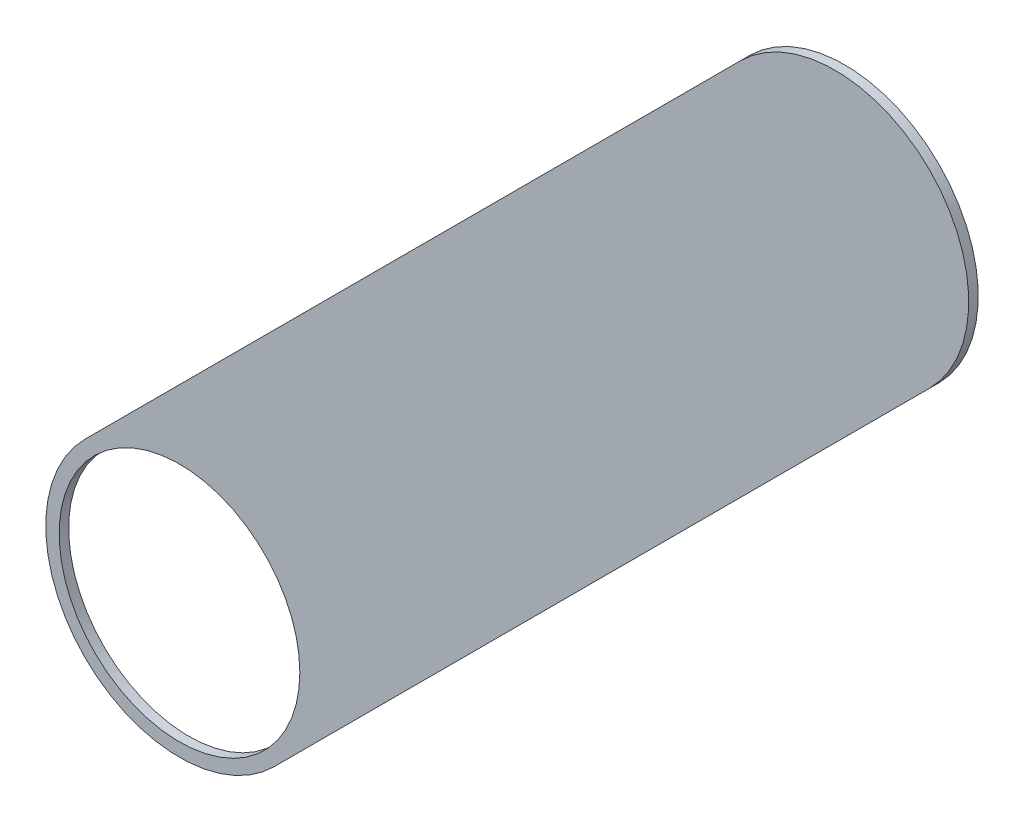
ISO-10303-21;
HEADER;
FILE_DESCRIPTION(('STEP AP214'),'2;1');
FILE_NAME('part.step','',(''),(''),'','','');
FILE_SCHEMA(('AUTOMOTIVE_DESIGN { 1 0 10303 214 1 1 1 1 }'));
ENDSEC;
DATA;
#1=APPLICATION_CONTEXT('core data for automotive mechanical design processes');
#2=APPLICATION_PROTOCOL_DEFINITION('international standard','automotive_design',2000,#1);
#3=PRODUCT_CONTEXT('',#1,'mechanical');
#4=PRODUCT('Part','Part','',(#3));
#5=PRODUCT_RELATED_PRODUCT_CATEGORY('part','',(#4));
#6=PRODUCT_DEFINITION_FORMATION('','',#4);
#7=PRODUCT_DEFINITION_CONTEXT('part definition',#1,'design');
#8=PRODUCT_DEFINITION('design','',#6,#7);
#9=PRODUCT_DEFINITION_SHAPE('','',#8);
#10=(LENGTH_UNIT() NAMED_UNIT(*) SI_UNIT(.MILLI.,.METRE.));
#11=(NAMED_UNIT(*) PLANE_ANGLE_UNIT() SI_UNIT($,.RADIAN.));
#12=(NAMED_UNIT(*) SI_UNIT($,.STERADIAN.) SOLID_ANGLE_UNIT());
#13=UNCERTAINTY_MEASURE_WITH_UNIT(LENGTH_MEASURE(1.E-05),#10,'distance_accuracy_value','');
#14=(GEOMETRIC_REPRESENTATION_CONTEXT(3) GLOBAL_UNCERTAINTY_ASSIGNED_CONTEXT((#13)) GLOBAL_UNIT_ASSIGNED_CONTEXT((#10,
#11,#12)) REPRESENTATION_CONTEXT('',''));
#15=CARTESIAN_POINT('',(0.,0.,0.));
#16=DIRECTION('',(0.,0.,1.));
#17=DIRECTION('',(1.,0.,0.));
#18=AXIS2_PLACEMENT_3D('',#15,#16,#17);
#19=CARTESIAN_POINT('',(51.00455636,116.67445804,0.));
#20=DIRECTION('',(-0.707106781186548,0.707106781186548,0.));
#21=DIRECTION('',(0.707106781186548,0.707106781186548,0.));
#22=AXIS2_PLACEMENT_3D('',#19,#20,#21);
#23=PLANE('',#22);
#24=DIRECTION('',(0.707106781186548,0.707106781186548,0.));
#25=VECTOR('',#24,1.);
#26=CARTESIAN_POINT('',(51.00455636,116.67445804,0.03556));
#27=LINE('',#26,#25);
#28=CARTESIAN_POINT('',(51.00455636,116.67445804,0.03556));
#29=VERTEX_POINT('',#28);
#30=CARTESIAN_POINT('',(53.45565636,119.12555804,0.03556));
#31=VERTEX_POINT('',#30);
#32=EDGE_CURVE('E11',#29,#31,#27,.T.);
#33=ORIENTED_EDGE('',*,*,#32,.F.);
#34=DIRECTION('',(0.,0.,1.));
#35=VECTOR('',#34,1.);
#36=CARTESIAN_POINT('',(51.00455636,116.67445804,0.));
#37=LINE('',#36,#35);
#38=CARTESIAN_POINT('',(51.00455636,116.67445804,0.));
#39=VERTEX_POINT('',#38);
#40=EDGE_CURVE('E24',#39,#29,#37,.T.);
#41=ORIENTED_EDGE('',*,*,#40,.F.);
#42=DIRECTION('',(0.707106781186548,0.707106781186548,0.));
#43=VECTOR('',#42,1.);
#44=CARTESIAN_POINT('',(51.00455636,116.67445804,0.));
#45=LINE('',#44,#43);
#46=CARTESIAN_POINT('',(53.45565636,119.12555804,0.));
#47=VERTEX_POINT('',#46);
#48=EDGE_CURVE('E96',#39,#47,#45,.T.);
#49=ORIENTED_EDGE('',*,*,#48,.T.);
#50=DIRECTION('',(0.,0.,1.));
#51=VECTOR('',#50,1.);
#52=CARTESIAN_POINT('',(53.45565636,119.12555804,0.));
#53=LINE('',#52,#51);
#54=EDGE_CURVE('E37',#47,#31,#53,.T.);
#55=ORIENTED_EDGE('',*,*,#54,.T.);
#56=EDGE_LOOP('',(#33,#41,#49,#55));
#57=FACE_BOUND('',#56,.T.);
#58=ADVANCED_FACE('F17',(#57),#23,.F.);
#59=CARTESIAN_POINT('',(50.6510036,117.0280108,0.));
#60=DIRECTION('',(0.,0.,-1.));
#61=DIRECTION('',(-0.707106781186548,0.707106781186548,0.));
#62=AXIS2_PLACEMENT_3D('',#59,#60,#61);
#63=CYLINDRICAL_SURFACE('',#62,0.499999108206441);
#64=CARTESIAN_POINT('',(50.6510036,117.0280108,0.03556));
#65=DIRECTION('',(0.,0.,1.));
#66=DIRECTION('',(-0.707106781186548,0.707106781186548,0.));
#67=AXIS2_PLACEMENT_3D('',#64,#65,#66);
#68=CIRCLE('',#67,0.499999108206441);
#69=CARTESIAN_POINT('',(50.29745084,117.38156356,0.03556));
#70=VERTEX_POINT('',#69);
#71=EDGE_CURVE('E92',#70,#29,#68,.T.);
#72=ORIENTED_EDGE('',*,*,#71,.F.);
#73=DIRECTION('',(0.,0.,1.));
#74=VECTOR('',#73,1.);
#75=CARTESIAN_POINT('',(50.29745084,117.38156356,0.));
#76=LINE('',#75,#74);
#77=CARTESIAN_POINT('',(50.29745084,117.38156356,0.));
#78=VERTEX_POINT('',#77);
#79=EDGE_CURVE('E90',#78,#70,#76,.T.);
#80=ORIENTED_EDGE('',*,*,#79,.F.);
#81=CARTESIAN_POINT('',(50.6510036,117.0280108,0.));
#82=DIRECTION('',(0.,0.,1.));
#83=DIRECTION('',(-0.707106781186548,0.707106781186548,0.));
#84=AXIS2_PLACEMENT_3D('',#81,#82,#83);
#85=CIRCLE('',#84,0.499999108206441);
#86=EDGE_CURVE('E88',#78,#39,#85,.T.);
#87=ORIENTED_EDGE('',*,*,#86,.T.);
#88=ORIENTED_EDGE('',*,*,#40,.T.);
#89=EDGE_LOOP('',(#72,#80,#87,#88));
#90=FACE_BOUND('',#89,.T.);
#91=ADVANCED_FACE('F111',(#90),#63,.T.);
#92=CARTESIAN_POINT('',(53.1021036,119.4791108,0.));
#93=DIRECTION('',(0.,0.,-1.));
#94=DIRECTION('',(0.707106781186555,-0.70710678118654,0.));
#95=AXIS2_PLACEMENT_3D('',#92,#93,#94);
#96=CYLINDRICAL_SURFACE('',#95,0.499999108206442);
#97=CARTESIAN_POINT('',(53.1021036,119.4791108,0.03556));
#98=DIRECTION('',(0.,0.,1.));
#99=DIRECTION('',(0.707106781186555,-0.70710678118654,0.));
#100=AXIS2_PLACEMENT_3D('',#97,#98,#99);
#101=CIRCLE('',#100,0.499999108206442);
#102=CARTESIAN_POINT('',(52.74855084,119.83266356,0.03556));
#103=VERTEX_POINT('',#102);
#104=EDGE_CURVE('E85',#31,#103,#101,.T.);
#105=ORIENTED_EDGE('',*,*,#104,.F.);
#106=ORIENTED_EDGE('',*,*,#54,.F.);
#107=CARTESIAN_POINT('',(53.1021036,119.4791108,0.));
#108=DIRECTION('',(0.,0.,1.));
#109=DIRECTION('',(0.707106781186555,-0.70710678118654,0.));
#110=AXIS2_PLACEMENT_3D('',#107,#108,#109);
#111=CIRCLE('',#110,0.499999108206442);
#112=CARTESIAN_POINT('',(52.74855084,119.83266356,0.));
#113=VERTEX_POINT('',#112);
#114=EDGE_CURVE('E82',#47,#113,#111,.T.);
#115=ORIENTED_EDGE('',*,*,#114,.T.);
#116=DIRECTION('',(0.,0.,1.));
#117=VECTOR('',#116,1.);
#118=CARTESIAN_POINT('',(52.74855084,119.83266356,0.));
#119=LINE('',#118,#117);
#120=EDGE_CURVE('E80',#113,#103,#119,.T.);
#121=ORIENTED_EDGE('',*,*,#120,.T.);
#122=EDGE_LOOP('',(#105,#106,#115,#121));
#123=FACE_BOUND('',#122,.T.);
#124=ADVANCED_FACE('F104',(#123),#96,.T.);
#125=CARTESIAN_POINT('',(52.74855084,119.83266356,0.));
#126=DIRECTION('',(0.707106781186548,-0.707106781186548,0.));
#127=DIRECTION('',(-0.707106781186548,-0.707106781186548,0.));
#128=AXIS2_PLACEMENT_3D('',#125,#126,#127);
#129=PLANE('',#128);
#130=DIRECTION('',(-0.707106781186548,-0.707106781186548,0.));
#131=VECTOR('',#130,1.);
#132=CARTESIAN_POINT('',(52.74855084,119.83266356,0.03556));
#133=LINE('',#132,#131);
#134=EDGE_CURVE('E77',#103,#70,#133,.T.);
#135=ORIENTED_EDGE('',*,*,#134,.F.);
#136=ORIENTED_EDGE('',*,*,#120,.F.);
#137=DIRECTION('',(-0.707106781186548,-0.707106781186548,0.));
#138=VECTOR('',#137,1.);
#139=CARTESIAN_POINT('',(52.74855084,119.83266356,0.));
#140=LINE('',#139,#138);
#141=EDGE_CURVE('E68',#113,#78,#140,.T.);
#142=ORIENTED_EDGE('',*,*,#141,.T.);
#143=ORIENTED_EDGE('',*,*,#79,.T.);
#144=EDGE_LOOP('',(#135,#136,#142,#143));
#145=FACE_BOUND('',#144,.T.);
#146=ADVANCED_FACE('F110',(#145),#129,.F.);
#147=CARTESIAN_POINT('',(50.6510036,117.0280108,0.));
#148=DIRECTION('',(0.,0.,-1.));
#149=DIRECTION('',(1.,0.,0.));
#150=AXIS2_PLACEMENT_3D('',#147,#148,#149);
#151=CYLINDRICAL_SURFACE('',#150,0.4499991);
#152=DIRECTION('',(0.,0.,1.));
#153=VECTOR('',#152,1.);
#154=CARTESIAN_POINT('',(51.1010027,117.0280108,0.));
#155=LINE('',#154,#153);
#156=CARTESIAN_POINT('',(51.1010027,117.0280108,0.));
#157=VERTEX_POINT('',#156);
#158=CARTESIAN_POINT('',(51.1010027,117.0280108,0.03556));
#159=VERTEX_POINT('',#158);
#160=EDGE_CURVE('E62',#157,#159,#155,.T.);
#161=ORIENTED_EDGE('',*,*,#160,.T.);
#162=CARTESIAN_POINT('',(50.6510036,117.0280108,0.03556));
#163=DIRECTION('',(0.,0.,1.));
#164=DIRECTION('',(1.,0.,0.));
#165=AXIS2_PLACEMENT_3D('',#162,#163,#164);
#166=CIRCLE('',#165,0.4499991);
#167=EDGE_CURVE('E67',#159,#159,#166,.T.);
#168=ORIENTED_EDGE('',*,*,#167,.T.);
#169=ORIENTED_EDGE('',*,*,#160,.F.);
#170=CARTESIAN_POINT('',(50.6510036,117.0280108,0.));
#171=DIRECTION('',(0.,0.,1.));
#172=DIRECTION('',(1.,0.,0.));
#173=AXIS2_PLACEMENT_3D('',#170,#171,#172);
#174=CIRCLE('',#173,0.4499991);
#175=EDGE_CURVE('E65',#157,#157,#174,.T.);
#176=ORIENTED_EDGE('',*,*,#175,.F.);
#177=EDGE_LOOP('',(#161,#168,#169,#176));
#178=FACE_BOUND('',#177,.T.);
#179=ADVANCED_FACE('F64',(#178),#151,.F.);
#180=CARTESIAN_POINT('',(51.00455636,116.67445804,0.));
#181=DIRECTION('',(0.,0.,-1.));
#182=DIRECTION('',(-1.,0.,0.));
#183=AXIS2_PLACEMENT_3D('',#180,#181,#182);
#184=PLANE('',#183);
#185=ORIENTED_EDGE('',*,*,#48,.F.);
#186=ORIENTED_EDGE('',*,*,#86,.F.);
#187=ORIENTED_EDGE('',*,*,#141,.F.);
#188=ORIENTED_EDGE('',*,*,#114,.F.);
#189=EDGE_LOOP('',(#185,#186,#187,#188));
#190=FACE_BOUND('',#189,.T.);
#191=ORIENTED_EDGE('',*,*,#175,.T.);
#192=EDGE_LOOP('',(#191));
#193=FACE_BOUND('',#192,.T.);
#194=ADVANCED_FACE('F71',(#190,#193),#184,.T.);
#195=CARTESIAN_POINT('',(51.00455636,116.67445804,0.03556));
#196=DIRECTION('',(0.,0.,-1.));
#197=DIRECTION('',(-1.,0.,0.));
#198=AXIS2_PLACEMENT_3D('',#195,#196,#197);
#199=PLANE('',#198);
#200=ORIENTED_EDGE('',*,*,#134,.T.);
#201=ORIENTED_EDGE('',*,*,#71,.T.);
#202=ORIENTED_EDGE('',*,*,#32,.T.);
#203=ORIENTED_EDGE('',*,*,#104,.T.);
#204=EDGE_LOOP('',(#200,#201,#202,#203));
#205=FACE_BOUND('',#204,.T.);
#206=ORIENTED_EDGE('',*,*,#167,.F.);
#207=EDGE_LOOP('',(#206));
#208=FACE_BOUND('',#207,.T.);
#209=ADVANCED_FACE('F107',(#205,#208),#199,.F.);
#210=CLOSED_SHELL('',(#58,#91,#124,#146,#179,#194,#209));
#211=MANIFOLD_SOLID_BREP('B1',#210);
#212=ADVANCED_BREP_SHAPE_REPRESENTATION('',(#18,#211),#14);
#213=SHAPE_DEFINITION_REPRESENTATION(#9,#212);
ENDSEC;
END-ISO-10303-21;
